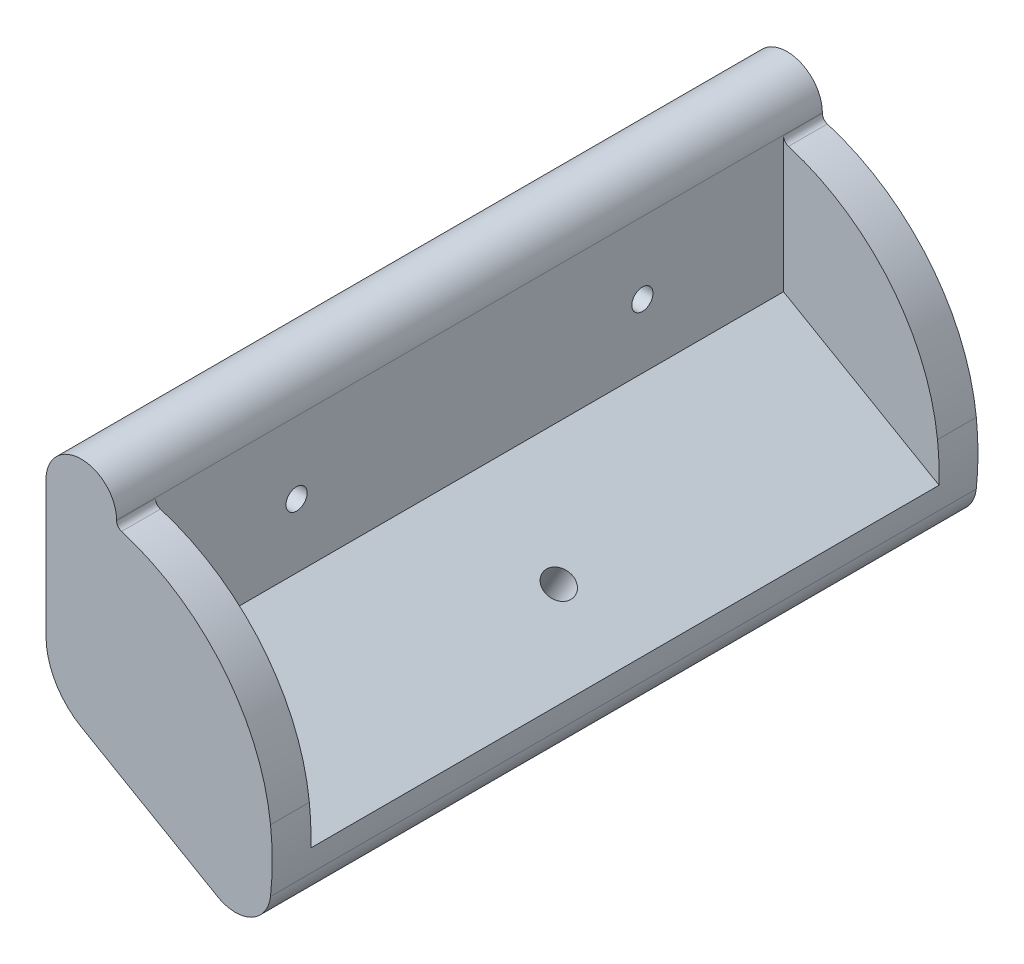
ISO-10303-21;
HEADER;
FILE_DESCRIPTION(('STEP AP214'),'2;1');
FILE_NAME('part.step','',(''),(''),'','','');
FILE_SCHEMA(('AUTOMOTIVE_DESIGN { 1 0 10303 214 1 1 1 1 }'));
ENDSEC;
DATA;
#1=APPLICATION_CONTEXT('core data for automotive mechanical design processes');
#2=APPLICATION_PROTOCOL_DEFINITION('international standard','automotive_design',2000,#1);
#3=PRODUCT_CONTEXT('',#1,'mechanical');
#4=PRODUCT('Part','Part','',(#3));
#5=PRODUCT_RELATED_PRODUCT_CATEGORY('part','',(#4));
#6=PRODUCT_DEFINITION_FORMATION('','',#4);
#7=PRODUCT_DEFINITION_CONTEXT('part definition',#1,'design');
#8=PRODUCT_DEFINITION('design','',#6,#7);
#9=PRODUCT_DEFINITION_SHAPE('','',#8);
#10=(LENGTH_UNIT() NAMED_UNIT(*) SI_UNIT(.MILLI.,.METRE.));
#11=(NAMED_UNIT(*) PLANE_ANGLE_UNIT() SI_UNIT($,.RADIAN.));
#12=(NAMED_UNIT(*) SI_UNIT($,.STERADIAN.) SOLID_ANGLE_UNIT());
#13=UNCERTAINTY_MEASURE_WITH_UNIT(LENGTH_MEASURE(1.E-05),#10,'distance_accuracy_value','');
#14=(GEOMETRIC_REPRESENTATION_CONTEXT(3) GLOBAL_UNCERTAINTY_ASSIGNED_CONTEXT((#13)) GLOBAL_UNIT_ASSIGNED_CONTEXT((#10,
#11,#12)) REPRESENTATION_CONTEXT('',''));
#15=CARTESIAN_POINT('',(0.,0.,0.));
#16=DIRECTION('',(0.,0.,1.));
#17=DIRECTION('',(1.,0.,0.));
#18=AXIS2_PLACEMENT_3D('',#15,#16,#17);
#19=CARTESIAN_POINT('',(11.,-5.07438614880043,5.5));
#20=DIRECTION('',(0.,0.,-1.));
#21=DIRECTION('',(-1.,0.,0.));
#22=AXIS2_PLACEMENT_3D('',#19,#20,#21);
#23=CYLINDRICAL_SURFACE('',#22,1.);
#24=CARTESIAN_POINT('',(11.,-5.07438614880043,5.5));
#25=DIRECTION('',(0.,0.,1.));
#26=DIRECTION('',(0.,-1.,0.));
#27=AXIS2_PLACEMENT_3D('',#24,#25,#26);
#28=CIRCLE('',#27,1.);
#29=CARTESIAN_POINT('',(10.,-5.07438614880043,5.50000000000001));
#30=VERTEX_POINT('',#29);
#31=CARTESIAN_POINT('',(10.7094477465742,-6.03124527533326,5.5));
#32=VERTEX_POINT('',#31);
#33=EDGE_CURVE('E217',#30,#32,#28,.T.);
#34=ORIENTED_EDGE('',*,*,#33,.T.);
#35=DIRECTION('',(0.,0.,-1.));
#36=VECTOR('',#35,1.);
#37=CARTESIAN_POINT('',(10.709447746575,-6.03124527533352,5.5));
#38=LINE('',#37,#36);
#39=CARTESIAN_POINT('',(10.709447746575,-6.03124527533352,0.));
#40=VERTEX_POINT('',#39);
#41=EDGE_CURVE('E43',#32,#40,#38,.T.);
#42=ORIENTED_EDGE('',*,*,#41,.T.);
#43=CARTESIAN_POINT('',(11.,-5.07438614880043,0.));
#44=DIRECTION('',(0.,0.,1.));
#45=DIRECTION('',(1.,0.,0.));
#46=AXIS2_PLACEMENT_3D('',#43,#44,#45);
#47=CIRCLE('',#46,1.);
#48=CARTESIAN_POINT('',(10.,-5.07438614880043,0.));
#49=VERTEX_POINT('',#48);
#50=EDGE_CURVE('E215',#40,#49,#47,.F.);
#51=ORIENTED_EDGE('',*,*,#50,.T.);
#52=DIRECTION('',(0.,0.,-1.));
#53=VECTOR('',#52,1.);
#54=CARTESIAN_POINT('',(10.,-5.07438614880043,100.));
#55=LINE('',#54,#53);
#56=EDGE_CURVE('E212',#30,#49,#55,.T.);
#57=ORIENTED_EDGE('',*,*,#56,.F.);
#58=EDGE_LOOP('',(#34,#42,#51,#57));
#59=FACE_BOUND('',#58,.T.);
#60=ADVANCED_FACE('F35',(#59),#23,.F.);
#61=CARTESIAN_POINT('',(11.,-5.07438614880043,100.));
#62=DIRECTION('',(0.,0.,-1.));
#63=DIRECTION('',(-1.,0.,0.));
#64=AXIS2_PLACEMENT_3D('',#61,#62,#63);
#65=CYLINDRICAL_SURFACE('',#64,1.);
#66=CARTESIAN_POINT('',(11.,-5.07438614880043,100.));
#67=DIRECTION('',(0.,0.,1.));
#68=DIRECTION('',(1.,0.,0.));
#69=AXIS2_PLACEMENT_3D('',#66,#67,#68);
#70=CIRCLE('',#69,1.);
#71=CARTESIAN_POINT('',(10.,-5.07438614880043,100.));
#72=VERTEX_POINT('',#71);
#73=CARTESIAN_POINT('',(10.7094477465733,-6.031245275333,100.));
#74=VERTEX_POINT('',#73);
#75=EDGE_CURVE('E209',#72,#74,#70,.T.);
#76=ORIENTED_EDGE('',*,*,#75,.T.);
#77=DIRECTION('',(0.,0.,-1.));
#78=VECTOR('',#77,1.);
#79=CARTESIAN_POINT('',(10.709447746575,-6.03124527533352,100.));
#80=LINE('',#79,#78);
#81=CARTESIAN_POINT('',(10.709447746575,-6.03124527533352,94.5));
#82=VERTEX_POINT('',#81);
#83=EDGE_CURVE('E219',#74,#82,#80,.T.);
#84=ORIENTED_EDGE('',*,*,#83,.T.);
#85=CARTESIAN_POINT('',(11.,-5.07438614880043,94.5));
#86=DIRECTION('',(0.,0.,-1.));
#87=DIRECTION('',(-1.,0.,0.));
#88=AXIS2_PLACEMENT_3D('',#85,#86,#87);
#89=CIRCLE('',#88,1.);
#90=CARTESIAN_POINT('',(10.,-5.07438614880043,94.5));
#91=VERTEX_POINT('',#90);
#92=EDGE_CURVE('E207',#82,#91,#89,.T.);
#93=ORIENTED_EDGE('',*,*,#92,.T.);
#94=DIRECTION('',(0.,0.,-1.));
#95=VECTOR('',#94,1.);
#96=CARTESIAN_POINT('',(10.,-5.07438614880043,100.));
#97=LINE('',#96,#95);
#98=EDGE_CURVE('E142',#72,#91,#97,.T.);
#99=ORIENTED_EDGE('',*,*,#98,.F.);
#100=EDGE_LOOP('',(#76,#84,#93,#99));
#101=FACE_BOUND('',#100,.T.);
#102=ADVANCED_FACE('F307',(#101),#65,.F.);
#103=CARTESIAN_POINT('',(5.,-5.,0.));
#104=DIRECTION('',(0.,0.,-1.));
#105=DIRECTION('',(-1.,0.,0.));
#106=AXIS2_PLACEMENT_3D('',#103,#104,#105);
#107=CYLINDRICAL_SURFACE('',#106,5.);
#108=DIRECTION('',(0.,0.,-1.));
#109=VECTOR('',#108,1.);
#110=CARTESIAN_POINT('',(10.,-5.,100.));
#111=LINE('',#110,#109);
#112=CARTESIAN_POINT('',(10.,-5.,0.));
#113=VERTEX_POINT('',#112);
#114=CARTESIAN_POINT('',(10.,-5.,100.));
#115=VERTEX_POINT('',#114);
#116=EDGE_CURVE('E195',#113,#115,#111,.F.);
#117=ORIENTED_EDGE('',*,*,#116,.F.);
#118=CARTESIAN_POINT('',(5.,-5.,0.));
#119=DIRECTION('',(0.,0.,1.));
#120=DIRECTION('',(1.,0.,0.));
#121=AXIS2_PLACEMENT_3D('',#118,#119,#120);
#122=CIRCLE('',#121,5.);
#123=CARTESIAN_POINT('',(0.,-5.,0.));
#124=VERTEX_POINT('',#123);
#125=EDGE_CURVE('E201',#124,#113,#122,.F.);
#126=ORIENTED_EDGE('',*,*,#125,.F.);
#127=DIRECTION('',(0.,0.,-1.));
#128=VECTOR('',#127,1.);
#129=CARTESIAN_POINT('',(0.,-5.,100.));
#130=LINE('',#129,#128);
#131=CARTESIAN_POINT('',(0.,-5.,100.));
#132=VERTEX_POINT('',#131);
#133=EDGE_CURVE('E198',#132,#124,#130,.T.);
#134=ORIENTED_EDGE('',*,*,#133,.F.);
#135=CARTESIAN_POINT('',(5.,-5.,100.));
#136=DIRECTION('',(0.,0.,1.));
#137=DIRECTION('',(1.,0.,0.));
#138=AXIS2_PLACEMENT_3D('',#135,#136,#137);
#139=CIRCLE('',#138,5.);
#140=EDGE_CURVE('E204',#115,#132,#139,.T.);
#141=ORIENTED_EDGE('',*,*,#140,.F.);
#142=EDGE_LOOP('',(#117,#126,#134,#141));
#143=FACE_BOUND('',#142,.T.);
#144=ADVANCED_FACE('F290',(#143),#107,.T.);
#145=CARTESIAN_POINT('',(10.,-24.2264973081037,100.));
#146=DIRECTION('',(-1.,0.,0.));
#147=DIRECTION('',(0.,-1.,0.));
#148=AXIS2_PLACEMENT_3D('',#145,#146,#147);
#149=PLANE('',#148);
#150=CARTESIAN_POINT('',(10.,-15.1415608175648,74.5));
#151=DIRECTION('',(1.,0.,0.));
#152=DIRECTION('',(0.,1.,0.));
#153=AXIS2_PLACEMENT_3D('',#150,#151,#152);
#154=CIRCLE('',#153,1.5);
#155=CARTESIAN_POINT('',(10.,-13.6415608175648,74.5));
#156=VERTEX_POINT('',#155);
#157=EDGE_CURVE('E271',#156,#156,#154,.T.);
#158=ORIENTED_EDGE('',*,*,#157,.F.);
#159=EDGE_LOOP('',(#158));
#160=FACE_BOUND('',#159,.T.);
#161=CARTESIAN_POINT('',(10.,-15.1415608175648,25.5));
#162=DIRECTION('',(1.,0.,0.));
#163=DIRECTION('',(0.,-1.,0.));
#164=AXIS2_PLACEMENT_3D('',#161,#162,#163);
#165=CIRCLE('',#164,1.5);
#166=CARTESIAN_POINT('',(10.,-16.6415608175648,25.5));
#167=VERTEX_POINT('',#166);
#168=EDGE_CURVE('E265',#167,#167,#165,.T.);
#169=ORIENTED_EDGE('',*,*,#168,.F.);
#170=EDGE_LOOP('',(#169));
#171=FACE_BOUND('',#170,.T.);
#172=DIRECTION('',(0.,-1.,0.));
#173=VECTOR('',#172,1.);
#174=CARTESIAN_POINT('',(10.,-24.2264973081037,5.50000000000001));
#175=LINE('',#174,#173);
#176=CARTESIAN_POINT('',(10.,-24.2264973081037,5.50000000000001));
#177=VERTEX_POINT('',#176);
#178=EDGE_CURVE('E145',#30,#177,#175,.T.);
#179=ORIENTED_EDGE('',*,*,#178,.F.);
#180=ORIENTED_EDGE('',*,*,#56,.T.);
#181=DIRECTION('',(0.,1.,0.));
#182=VECTOR('',#181,1.);
#183=CARTESIAN_POINT('',(10.,-24.2264973081037,0.));
#184=LINE('',#183,#182);
#185=EDGE_CURVE('E170',#49,#113,#184,.T.);
#186=ORIENTED_EDGE('',*,*,#185,.T.);
#187=ORIENTED_EDGE('',*,*,#116,.T.);
#188=DIRECTION('',(0.,1.,0.));
#189=VECTOR('',#188,1.);
#190=CARTESIAN_POINT('',(10.,-24.2264973081037,100.));
#191=LINE('',#190,#189);
#192=EDGE_CURVE('E162',#72,#115,#191,.T.);
#193=ORIENTED_EDGE('',*,*,#192,.F.);
#194=ORIENTED_EDGE('',*,*,#98,.T.);
#195=DIRECTION('',(0.,1.,0.));
#196=VECTOR('',#195,1.);
#197=CARTESIAN_POINT('',(10.,-6.05662432702588,94.5));
#198=LINE('',#197,#196);
#199=CARTESIAN_POINT('',(10.,-24.2264973081037,94.5));
#200=VERTEX_POINT('',#199);
#201=EDGE_CURVE('E135',#200,#91,#198,.T.);
#202=ORIENTED_EDGE('',*,*,#201,.F.);
#203=DIRECTION('',(0.,0.,-1.));
#204=VECTOR('',#203,1.);
#205=CARTESIAN_POINT('',(10.,-24.2264973081037,100.));
#206=LINE('',#205,#204);
#207=EDGE_CURVE('E139',#200,#177,#206,.T.);
#208=ORIENTED_EDGE('',*,*,#207,.T.);
#209=EDGE_LOOP('',(#179,#180,#186,#187,#193,#194,#202,#208));
#210=FACE_BOUND('',#209,.T.);
#211=ADVANCED_FACE('F137',(#160,#171,#210),#149,.F.);
#212=CARTESIAN_POINT('',(0.,0.,100.));
#213=DIRECTION('',(1.,0.,0.));
#214=DIRECTION('',(0.,1.,0.));
#215=AXIS2_PLACEMENT_3D('',#212,#213,#214);
#216=PLANE('',#215);
#217=CARTESIAN_POINT('',(0.,-15.1415608175648,74.5));
#218=DIRECTION('',(1.,0.,0.));
#219=DIRECTION('',(0.,1.,0.));
#220=AXIS2_PLACEMENT_3D('',#217,#218,#219);
#221=CIRCLE('',#220,1.5);
#222=CARTESIAN_POINT('',(0.,-13.6415608175648,74.5));
#223=VERTEX_POINT('',#222);
#224=EDGE_CURVE('E146',#223,#223,#221,.T.);
#225=ORIENTED_EDGE('',*,*,#224,.T.);
#226=EDGE_LOOP('',(#225));
#227=FACE_BOUND('',#226,.T.);
#228=CARTESIAN_POINT('',(0.,-15.1415608175648,25.5));
#229=DIRECTION('',(1.,0.,0.));
#230=DIRECTION('',(0.,-1.,0.));
#231=AXIS2_PLACEMENT_3D('',#228,#229,#230);
#232=CIRCLE('',#231,1.5);
#233=CARTESIAN_POINT('',(0.,-16.6415608175648,25.5));
#234=VERTEX_POINT('',#233);
#235=EDGE_CURVE('E268',#234,#234,#232,.T.);
#236=ORIENTED_EDGE('',*,*,#235,.T.);
#237=EDGE_LOOP('',(#236));
#238=FACE_BOUND('',#237,.T.);
#239=DIRECTION('',(0.,-1.,0.));
#240=VECTOR('',#239,1.);
#241=CARTESIAN_POINT('',(0.,0.,100.));
#242=LINE('',#241,#240);
#243=CARTESIAN_POINT('',(0.,-24.2264973081037,100.));
#244=VERTEX_POINT('',#243);
#245=EDGE_CURVE('E242',#132,#244,#242,.T.);
#246=ORIENTED_EDGE('',*,*,#245,.F.);
#247=ORIENTED_EDGE('',*,*,#133,.T.);
#248=DIRECTION('',(0.,-1.,0.));
#249=VECTOR('',#248,1.);
#250=CARTESIAN_POINT('',(0.,0.,0.));
#251=LINE('',#250,#249);
#252=CARTESIAN_POINT('',(0.,-24.2264973081037,0.));
#253=VERTEX_POINT('',#252);
#254=EDGE_CURVE('E251',#124,#253,#251,.T.);
#255=ORIENTED_EDGE('',*,*,#254,.T.);
#256=DIRECTION('',(0.,0.,-1.));
#257=VECTOR('',#256,1.);
#258=CARTESIAN_POINT('',(0.,-24.2264973081037,100.));
#259=LINE('',#258,#257);
#260=EDGE_CURVE('E165',#244,#253,#259,.T.);
#261=ORIENTED_EDGE('',*,*,#260,.F.);
#262=EDGE_LOOP('',(#246,#247,#255,#261));
#263=FACE_BOUND('',#262,.T.);
#264=ADVANCED_FACE('F277',(#227,#238,#263),#216,.F.);
#265=CARTESIAN_POINT('',(10.,-24.2264973081037,100.));
#266=DIRECTION('',(0.,0.,-1.));
#267=DIRECTION('',(-1.,0.,0.));
#268=AXIS2_PLACEMENT_3D('',#265,#266,#267);
#269=CYLINDRICAL_SURFACE('',#268,10.);
#270=CARTESIAN_POINT('',(10.,-24.2264973081037,0.));
#271=DIRECTION('',(0.,0.,1.));
#272=DIRECTION('',(1.,0.,0.));
#273=AXIS2_PLACEMENT_3D('',#270,#271,#272);
#274=CIRCLE('',#273,10.);
#275=CARTESIAN_POINT('',(5.00000000000007,-32.8867513459481,0.));
#276=VERTEX_POINT('',#275);
#277=EDGE_CURVE('E247',#253,#276,#274,.T.);
#278=ORIENTED_EDGE('',*,*,#277,.T.);
#279=DIRECTION('',(0.,0.,-1.));
#280=VECTOR('',#279,1.);
#281=CARTESIAN_POINT('',(5.00000000000007,-32.8867513459481,100.));
#282=LINE('',#281,#280);
#283=CARTESIAN_POINT('',(5.00000000000007,-32.8867513459481,100.));
#284=VERTEX_POINT('',#283);
#285=EDGE_CURVE('E161',#284,#276,#282,.T.);
#286=ORIENTED_EDGE('',*,*,#285,.F.);
#287=CARTESIAN_POINT('',(10.,-24.2264973081037,100.));
#288=DIRECTION('',(0.,0.,1.));
#289=DIRECTION('',(1.,0.,0.));
#290=AXIS2_PLACEMENT_3D('',#287,#288,#289);
#291=CIRCLE('',#290,10.);
#292=EDGE_CURVE('E244',#244,#284,#291,.T.);
#293=ORIENTED_EDGE('',*,*,#292,.F.);
#294=ORIENTED_EDGE('',*,*,#260,.T.);
#295=EDGE_LOOP('',(#278,#286,#293,#294));
#296=FACE_BOUND('',#295,.T.);
#297=ADVANCED_FACE('F337',(#296),#269,.T.);
#298=CARTESIAN_POINT('',(5.00000000000007,-32.8867513459481,100.));
#299=DIRECTION('',(0.499999999999998,0.86602540378444,0.));
#300=DIRECTION('',(-0.86602540378444,0.499999999999998,0.));
#301=AXIS2_PLACEMENT_3D('',#298,#299,#300);
#302=PLANE('',#301);
#303=CARTESIAN_POINT('',(17.6554445662277,-40.193375672974,50.));
#304=DIRECTION('',(0.499999999999998,0.86602540378444,0.));
#305=DIRECTION('',(-0.86602540378444,0.499999999999998,0.));
#306=AXIS2_PLACEMENT_3D('',#303,#304,#305);
#307=CIRCLE('',#306,2.00000000000001);
#308=CARTESIAN_POINT('',(15.9233937586588,-39.193375672974,50.));
#309=VERTEX_POINT('',#308);
#310=EDGE_CURVE('E254',#309,#309,#307,.T.);
#311=ORIENTED_EDGE('',*,*,#310,.T.);
#312=EDGE_LOOP('',(#311));
#313=FACE_BOUND('',#312,.T.);
#314=DIRECTION('',(0.86602540378444,-0.499999999999998,0.));
#315=VECTOR('',#314,1.);
#316=CARTESIAN_POINT('',(5.00000000000007,-32.8867513459481,0.));
#317=LINE('',#316,#315);
#318=CARTESIAN_POINT('',(24.3350746408215,-44.0498618946278,0.));
#319=VERTEX_POINT('',#318);
#320=EDGE_CURVE('E243',#276,#319,#317,.T.);
#321=ORIENTED_EDGE('',*,*,#320,.T.);
#322=DIRECTION('',(0.,0.,1.));
#323=VECTOR('',#322,1.);
#324=CARTESIAN_POINT('',(24.3350746408215,-44.0498618946278,100.));
#325=LINE('',#324,#323);
#326=CARTESIAN_POINT('',(24.3350746408215,-44.0498618946278,100.));
#327=VERTEX_POINT('',#326);
#328=EDGE_CURVE('E191',#319,#327,#325,.T.);
#329=ORIENTED_EDGE('',*,*,#328,.T.);
#330=DIRECTION('',(0.86602540378444,-0.499999999999998,0.));
#331=VECTOR('',#330,1.);
#332=CARTESIAN_POINT('',(5.00000000000007,-32.8867513459481,100.));
#333=LINE('',#332,#331);
#334=EDGE_CURVE('E167',#284,#327,#333,.T.);
#335=ORIENTED_EDGE('',*,*,#334,.F.);
#336=ORIENTED_EDGE('',*,*,#285,.T.);
#337=EDGE_LOOP('',(#321,#329,#335,#336));
#338=FACE_BOUND('',#337,.T.);
#339=ADVANCED_FACE('F339',(#313,#338),#302,.F.);
#340=CARTESIAN_POINT('',(35.3108891324554,-38.8397459621555,100.));
#341=DIRECTION('',(-0.499999999999998,-0.86602540378444,0.));
#342=DIRECTION('',(0.86602540378444,-0.499999999999998,0.));
#343=AXIS2_PLACEMENT_3D('',#340,#341,#342);
#344=PLANE('',#343);
#345=CARTESIAN_POINT('',(22.6554445662277,-31.5331216351296,50.));
#346=DIRECTION('',(0.499999999999998,0.86602540378444,0.));
#347=DIRECTION('',(-0.86602540378444,0.499999999999998,0.));
#348=AXIS2_PLACEMENT_3D('',#345,#346,#347);
#349=CIRCLE('',#348,2.00000000000001);
#350=CARTESIAN_POINT('',(20.9233937586588,-30.5331216351296,50.));
#351=VERTEX_POINT('',#350);
#352=EDGE_CURVE('E155',#351,#351,#349,.T.);
#353=ORIENTED_EDGE('',*,*,#352,.F.);
#354=EDGE_LOOP('',(#353));
#355=FACE_BOUND('',#354,.T.);
#356=DIRECTION('',(0.86602540378444,-0.499999999999998,0.));
#357=VECTOR('',#356,1.);
#358=CARTESIAN_POINT('',(10.,-24.2264973081037,94.5));
#359=LINE('',#358,#357);
#360=CARTESIAN_POINT('',(32.0365663016986,-36.9493147944044,94.5));
#361=VERTEX_POINT('',#360);
#362=EDGE_CURVE('E149',#200,#361,#359,.T.);
#363=ORIENTED_EDGE('',*,*,#362,.T.);
#364=DIRECTION('',(0.,0.,-1.));
#365=VECTOR('',#364,1.);
#366=CARTESIAN_POINT('',(32.0365663016986,-36.9493147944044,94.5));
#367=LINE('',#366,#365);
#368=CARTESIAN_POINT('',(32.0365663016986,-36.9493147944044,5.50000000000001));
#369=VERTEX_POINT('',#368);
#370=EDGE_CURVE('E179',#361,#369,#367,.T.);
#371=ORIENTED_EDGE('',*,*,#370,.T.);
#372=DIRECTION('',(0.86602540378444,-0.499999999999998,0.));
#373=VECTOR('',#372,1.);
#374=CARTESIAN_POINT('',(10.,-24.2264973081037,5.5));
#375=LINE('',#374,#373);
#376=EDGE_CURVE('E156',#177,#369,#375,.T.);
#377=ORIENTED_EDGE('',*,*,#376,.F.);
#378=ORIENTED_EDGE('',*,*,#207,.F.);
#379=EDGE_LOOP('',(#363,#371,#377,#378));
#380=FACE_BOUND('',#379,.T.);
#381=ADVANCED_FACE('F159',(#355,#380),#344,.F.);
#382=CARTESIAN_POINT('',(10.,-24.2264973081037,100.));
#383=DIRECTION('',(0.,0.,1.));
#384=DIRECTION('',(1.,0.,0.));
#385=AXIS2_PLACEMENT_3D('',#382,#383,#384);
#386=PLANE('',#385);
#387=CARTESIAN_POINT('',(-7.94765588199535,-35.8259375803773,100.));
#388=DIRECTION('',(0.,0.,1.));
#389=DIRECTION('',(1.,0.,0.));
#390=AXIS2_PLACEMENT_3D('',#387,#388,#389);
#391=CIRCLE('',#390,40.);
#392=CARTESIAN_POINT('',(31.804036144081,-40.2759916321811,100.));
#393=VERTEX_POINT('',#392);
#394=CARTESIAN_POINT('',(31.8144882212888,-31.470263544173,100.));
#395=VERTEX_POINT('',#394);
#396=EDGE_CURVE('E175',#393,#395,#391,.T.);
#397=ORIENTED_EDGE('',*,*,#396,.T.);
#398=CARTESIAN_POINT('',(1.99288014382569,-34.7370190713262,100.));
#399=DIRECTION('',(0.,0.,1.));
#400=DIRECTION('',(1.,0.,0.));
#401=AXIS2_PLACEMENT_3D('',#398,#399,#400);
#402=CIRCLE('',#401,30.);
#403=EDGE_CURVE('E228',#395,#74,#402,.T.);
#404=ORIENTED_EDGE('',*,*,#403,.T.);
#405=ORIENTED_EDGE('',*,*,#75,.F.);
#406=ORIENTED_EDGE('',*,*,#192,.T.);
#407=ORIENTED_EDGE('',*,*,#140,.T.);
#408=ORIENTED_EDGE('',*,*,#245,.T.);
#409=ORIENTED_EDGE('',*,*,#292,.T.);
#410=ORIENTED_EDGE('',*,*,#334,.T.);
#411=CARTESIAN_POINT('',(26.8350746408215,-39.7197348757056,100.));
#412=DIRECTION('',(0.,0.,1.));
#413=DIRECTION('',(1.,0.,0.));
#414=AXIS2_PLACEMENT_3D('',#411,#412,#413);
#415=CIRCLE('',#414,5.);
#416=EDGE_CURVE('E193',#327,#393,#415,.T.);
#417=ORIENTED_EDGE('',*,*,#416,.T.);
#418=EDGE_LOOP('',(#397,#404,#405,#406,#407,#408,#409,#410,#417));
#419=FACE_BOUND('',#418,.T.);
#420=ADVANCED_FACE('F324',(#419),#386,.T.);
#421=CARTESIAN_POINT('',(10.,-24.2264973081037,0.));
#422=DIRECTION('',(0.,0.,1.));
#423=DIRECTION('',(1.,0.,0.));
#424=AXIS2_PLACEMENT_3D('',#421,#422,#423);
#425=PLANE('',#424);
#426=ORIENTED_EDGE('',*,*,#50,.F.);
#427=CARTESIAN_POINT('',(1.99288014382569,-34.7370190713262,0.));
#428=DIRECTION('',(0.,0.,1.));
#429=DIRECTION('',(1.,0.,0.));
#430=AXIS2_PLACEMENT_3D('',#427,#428,#429);
#431=CIRCLE('',#430,30.);
#432=CARTESIAN_POINT('',(31.8144882212888,-31.470263544173,0.));
#433=VERTEX_POINT('',#432);
#434=EDGE_CURVE('E11',#40,#433,#431,.F.);
#435=ORIENTED_EDGE('',*,*,#434,.T.);
#436=CARTESIAN_POINT('',(-7.94765588199535,-35.8259375803773,0.));
#437=DIRECTION('',(0.,0.,1.));
#438=DIRECTION('',(1.,0.,0.));
#439=AXIS2_PLACEMENT_3D('',#436,#437,#438);
#440=CIRCLE('',#439,40.);
#441=CARTESIAN_POINT('',(31.804036144081,-40.2759916321811,0.));
#442=VERTEX_POINT('',#441);
#443=EDGE_CURVE('E184',#433,#442,#440,.F.);
#444=ORIENTED_EDGE('',*,*,#443,.T.);
#445=CARTESIAN_POINT('',(26.8350746408215,-39.7197348757056,0.));
#446=DIRECTION('',(0.,0.,1.));
#447=DIRECTION('',(1.,0.,0.));
#448=AXIS2_PLACEMENT_3D('',#445,#446,#447);
#449=CIRCLE('',#448,5.);
#450=EDGE_CURVE('E189',#442,#319,#449,.F.);
#451=ORIENTED_EDGE('',*,*,#450,.T.);
#452=ORIENTED_EDGE('',*,*,#320,.F.);
#453=ORIENTED_EDGE('',*,*,#277,.F.);
#454=ORIENTED_EDGE('',*,*,#254,.F.);
#455=ORIENTED_EDGE('',*,*,#125,.T.);
#456=ORIENTED_EDGE('',*,*,#185,.F.);
#457=EDGE_LOOP('',(#426,#435,#444,#451,#452,#453,#454,#455,#456));
#458=FACE_BOUND('',#457,.T.);
#459=ADVANCED_FACE('F239',(#458),#425,.F.);
#460=CARTESIAN_POINT('',(10.0777222831139,-53.318375672974,50.));
#461=DIRECTION('',(0.499999999999998,0.86602540378444,0.));
#462=DIRECTION('',(-0.86602540378444,0.499999999999998,0.));
#463=AXIS2_PLACEMENT_3D('',#460,#461,#462);
#464=CYLINDRICAL_SURFACE('',#463,2.00000000000001);
#465=ORIENTED_EDGE('',*,*,#352,.T.);
#466=EDGE_LOOP('',(#465));
#467=FACE_BOUND('',#466,.T.);
#468=ORIENTED_EDGE('',*,*,#310,.F.);
#469=EDGE_LOOP('',(#468));
#470=FACE_BOUND('',#469,.T.);
#471=ADVANCED_FACE('F402',(#467,#470),#464,.F.);
#472=CARTESIAN_POINT('',(20.4903810567665,-6.05662432702588,94.5));
#473=DIRECTION('',(0.,0.,-1.));
#474=DIRECTION('',(-1.,0.,0.));
#475=AXIS2_PLACEMENT_3D('',#472,#473,#474);
#476=PLANE('',#475);
#477=ORIENTED_EDGE('',*,*,#92,.F.);
#478=CARTESIAN_POINT('',(1.99288014382569,-34.7370190713262,94.5));
#479=DIRECTION('',(0.,0.,-1.));
#480=DIRECTION('',(-1.,0.,0.));
#481=AXIS2_PLACEMENT_3D('',#478,#479,#480);
#482=CIRCLE('',#481,30.);
#483=CARTESIAN_POINT('',(31.8144882212888,-31.470263544173,94.5));
#484=VERTEX_POINT('',#483);
#485=EDGE_CURVE('E222',#82,#484,#482,.T.);
#486=ORIENTED_EDGE('',*,*,#485,.T.);
#487=CARTESIAN_POINT('',(-7.94765588199535,-35.8259375803773,94.5));
#488=DIRECTION('',(0.,0.,-1.));
#489=DIRECTION('',(-1.,0.,0.));
#490=AXIS2_PLACEMENT_3D('',#487,#488,#489);
#491=CIRCLE('',#490,40.);
#492=EDGE_CURVE('E152',#484,#361,#491,.T.);
#493=ORIENTED_EDGE('',*,*,#492,.T.);
#494=ORIENTED_EDGE('',*,*,#362,.F.);
#495=ORIENTED_EDGE('',*,*,#201,.T.);
#496=EDGE_LOOP('',(#477,#486,#493,#494,#495));
#497=FACE_BOUND('',#496,.T.);
#498=ADVANCED_FACE('F150',(#497),#476,.T.);
#499=CARTESIAN_POINT('',(20.4903810567665,-6.05662432702588,5.5));
#500=DIRECTION('',(0.,0.,1.));
#501=DIRECTION('',(0.,-1.,0.));
#502=AXIS2_PLACEMENT_3D('',#499,#500,#501);
#503=PLANE('',#502);
#504=CARTESIAN_POINT('',(-7.94765588199535,-35.8259375803773,5.50000000000001));
#505=DIRECTION('',(0.,0.,1.));
#506=DIRECTION('',(0.,-1.,0.));
#507=AXIS2_PLACEMENT_3D('',#504,#505,#506);
#508=CIRCLE('',#507,40.);
#509=CARTESIAN_POINT('',(31.8144882212888,-31.470263544173,5.50000000000001));
#510=VERTEX_POINT('',#509);
#511=EDGE_CURVE('E181',#369,#510,#508,.T.);
#512=ORIENTED_EDGE('',*,*,#511,.T.);
#513=CARTESIAN_POINT('',(1.99288014382569,-34.7370190713262,5.50000000000001));
#514=DIRECTION('',(0.,0.,1.));
#515=DIRECTION('',(0.,-1.,0.));
#516=AXIS2_PLACEMENT_3D('',#513,#514,#515);
#517=CIRCLE('',#516,30.);
#518=EDGE_CURVE('E230',#510,#32,#517,.T.);
#519=ORIENTED_EDGE('',*,*,#518,.T.);
#520=ORIENTED_EDGE('',*,*,#33,.F.);
#521=ORIENTED_EDGE('',*,*,#178,.T.);
#522=ORIENTED_EDGE('',*,*,#376,.T.);
#523=EDGE_LOOP('',(#512,#519,#520,#521,#522));
#524=FACE_BOUND('',#523,.T.);
#525=ADVANCED_FACE('F233',(#524),#503,.T.);
#526=CARTESIAN_POINT('',(-7.94765588199535,-35.8259375803773,100.));
#527=DIRECTION('',(0.,0.,-1.));
#528=DIRECTION('',(-1.,0.,0.));
#529=AXIS2_PLACEMENT_3D('',#526,#527,#528);
#530=CYLINDRICAL_SURFACE('',#529,40.);
#531=ORIENTED_EDGE('',*,*,#492,.F.);
#532=DIRECTION('',(0.,0.,-1.));
#533=VECTOR('',#532,1.);
#534=CARTESIAN_POINT('',(31.8144882212888,-31.470263544173,100.));
#535=LINE('',#534,#533);
#536=EDGE_CURVE('E226',#484,#395,#535,.F.);
#537=ORIENTED_EDGE('',*,*,#536,.T.);
#538=ORIENTED_EDGE('',*,*,#396,.F.);
#539=DIRECTION('',(0.,0.,-1.));
#540=VECTOR('',#539,1.);
#541=CARTESIAN_POINT('',(31.804036144081,-40.2759916321811,100.));
#542=LINE('',#541,#540);
#543=EDGE_CURVE('E186',#393,#442,#542,.T.);
#544=ORIENTED_EDGE('',*,*,#543,.T.);
#545=ORIENTED_EDGE('',*,*,#443,.F.);
#546=DIRECTION('',(0.,0.,-1.));
#547=VECTOR('',#546,1.);
#548=CARTESIAN_POINT('',(31.8144882212888,-31.470263544173,100.));
#549=LINE('',#548,#547);
#550=EDGE_CURVE('E224',#433,#510,#549,.F.);
#551=ORIENTED_EDGE('',*,*,#550,.T.);
#552=ORIENTED_EDGE('',*,*,#511,.F.);
#553=ORIENTED_EDGE('',*,*,#370,.F.);
#554=EDGE_LOOP('',(#531,#537,#538,#544,#545,#551,#552,#553));
#555=FACE_BOUND('',#554,.T.);
#556=ADVANCED_FACE('F301',(#555),#530,.T.);
#557=CARTESIAN_POINT('',(26.8350746408215,-39.7197348757056,100.));
#558=DIRECTION('',(0.,0.,-1.));
#559=DIRECTION('',(-1.,0.,0.));
#560=AXIS2_PLACEMENT_3D('',#557,#558,#559);
#561=CYLINDRICAL_SURFACE('',#560,5.);
#562=ORIENTED_EDGE('',*,*,#416,.F.);
#563=ORIENTED_EDGE('',*,*,#328,.F.);
#564=ORIENTED_EDGE('',*,*,#450,.F.);
#565=ORIENTED_EDGE('',*,*,#543,.F.);
#566=EDGE_LOOP('',(#562,#563,#564,#565));
#567=FACE_BOUND('',#566,.T.);
#568=ADVANCED_FACE('F295',(#567),#561,.T.);
#569=CARTESIAN_POINT('',(0.,-15.1415608175648,25.5));
#570=DIRECTION('',(1.,0.,0.));
#571=DIRECTION('',(0.,1.,0.));
#572=AXIS2_PLACEMENT_3D('',#569,#570,#571);
#573=CYLINDRICAL_SURFACE('',#572,1.5);
#574=ORIENTED_EDGE('',*,*,#235,.F.);
#575=EDGE_LOOP('',(#574));
#576=FACE_BOUND('',#575,.T.);
#577=ORIENTED_EDGE('',*,*,#168,.T.);
#578=EDGE_LOOP('',(#577));
#579=FACE_BOUND('',#578,.T.);
#580=ADVANCED_FACE('F284',(#576,#579),#573,.F.);
#581=CARTESIAN_POINT('',(0.,-15.1415608175648,74.5));
#582=DIRECTION('',(1.,0.,0.));
#583=DIRECTION('',(0.,1.,0.));
#584=AXIS2_PLACEMENT_3D('',#581,#582,#583);
#585=CYLINDRICAL_SURFACE('',#584,1.5);
#586=ORIENTED_EDGE('',*,*,#224,.F.);
#587=EDGE_LOOP('',(#586));
#588=FACE_BOUND('',#587,.T.);
#589=ORIENTED_EDGE('',*,*,#157,.T.);
#590=EDGE_LOOP('',(#589));
#591=FACE_BOUND('',#590,.T.);
#592=ADVANCED_FACE('F280',(#588,#591),#585,.F.);
#593=CARTESIAN_POINT('',(1.99288014382569,-34.7370190713262,100.));
#594=DIRECTION('',(0.,0.,1.));
#595=DIRECTION('',(1.,0.,0.));
#596=AXIS2_PLACEMENT_3D('',#593,#594,#595);
#597=CYLINDRICAL_SURFACE('',#596,30.);
#598=ORIENTED_EDGE('',*,*,#403,.F.);
#599=ORIENTED_EDGE('',*,*,#536,.F.);
#600=ORIENTED_EDGE('',*,*,#485,.F.);
#601=ORIENTED_EDGE('',*,*,#83,.F.);
#602=EDGE_LOOP('',(#598,#599,#600,#601));
#603=FACE_BOUND('',#602,.T.);
#604=ADVANCED_FACE('F283',(#603),#597,.T.);
#605=CARTESIAN_POINT('',(1.99288014382569,-34.7370190713262,100.));
#606=DIRECTION('',(0.,0.,1.));
#607=DIRECTION('',(1.,0.,0.));
#608=AXIS2_PLACEMENT_3D('',#605,#606,#607);
#609=CYLINDRICAL_SURFACE('',#608,30.);
#610=ORIENTED_EDGE('',*,*,#518,.F.);
#611=ORIENTED_EDGE('',*,*,#550,.F.);
#612=ORIENTED_EDGE('',*,*,#434,.F.);
#613=ORIENTED_EDGE('',*,*,#41,.F.);
#614=EDGE_LOOP('',(#610,#611,#612,#613));
#615=FACE_BOUND('',#614,.T.);
#616=ADVANCED_FACE('F37',(#615),#609,.T.);
#617=CLOSED_SHELL('',(#60,#102,#144,#211,#264,#297,#339,#381,#420,#459,#471,#498,#525,#556,#568,
#580,#592,#604,#616));
#618=MANIFOLD_SOLID_BREP('B2',#617);
#619=ADVANCED_BREP_SHAPE_REPRESENTATION('',(#18,#618),#14);
#620=SHAPE_DEFINITION_REPRESENTATION(#9,#619);
ENDSEC;
END-ISO-10303-21;
